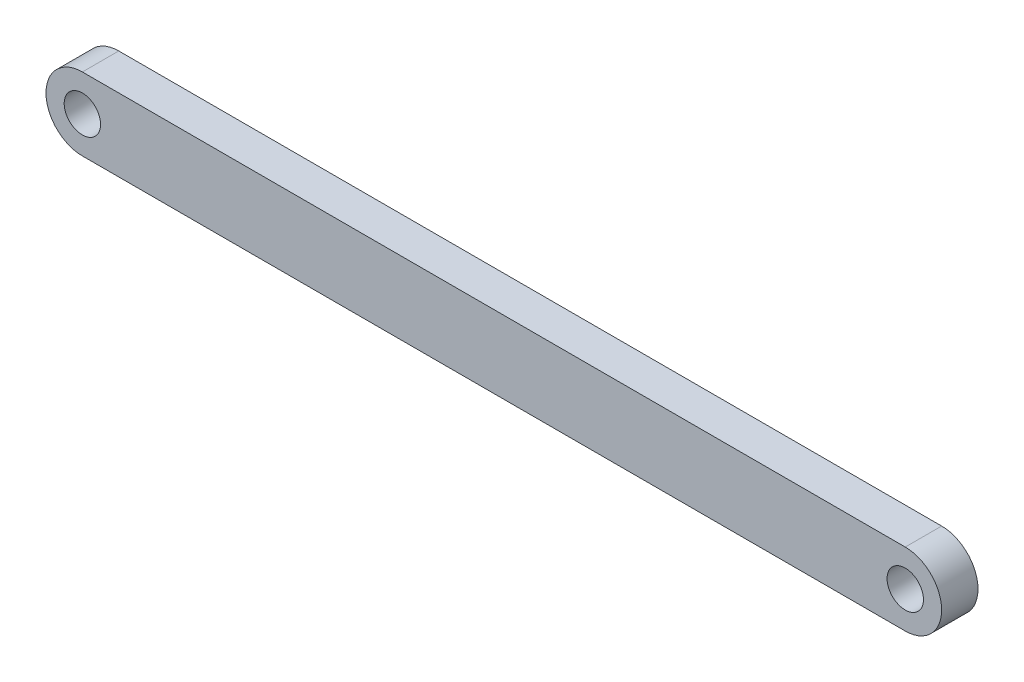
ISO-10303-21;
HEADER;
FILE_DESCRIPTION(('STEP AP214'),'2;1');
FILE_NAME('part.step','',(''),(''),'','','');
FILE_SCHEMA(('AUTOMOTIVE_DESIGN { 1 0 10303 214 1 1 1 1 }'));
ENDSEC;
DATA;
#1=APPLICATION_CONTEXT('core data for automotive mechanical design processes');
#2=APPLICATION_PROTOCOL_DEFINITION('international standard','automotive_design',2000,#1);
#3=PRODUCT_CONTEXT('',#1,'mechanical');
#4=PRODUCT('Part','Part','',(#3));
#5=PRODUCT_RELATED_PRODUCT_CATEGORY('part','',(#4));
#6=PRODUCT_DEFINITION_FORMATION('','',#4);
#7=PRODUCT_DEFINITION_CONTEXT('part definition',#1,'design');
#8=PRODUCT_DEFINITION('design','',#6,#7);
#9=PRODUCT_DEFINITION_SHAPE('','',#8);
#10=(LENGTH_UNIT() NAMED_UNIT(*) SI_UNIT(.MILLI.,.METRE.));
#11=(NAMED_UNIT(*) PLANE_ANGLE_UNIT() SI_UNIT($,.RADIAN.));
#12=(NAMED_UNIT(*) SI_UNIT($,.STERADIAN.) SOLID_ANGLE_UNIT());
#13=UNCERTAINTY_MEASURE_WITH_UNIT(LENGTH_MEASURE(1.E-05),#10,'distance_accuracy_value','');
#14=(GEOMETRIC_REPRESENTATION_CONTEXT(3) GLOBAL_UNCERTAINTY_ASSIGNED_CONTEXT((#13)) GLOBAL_UNIT_ASSIGNED_CONTEXT((#10,
#11,#12)) REPRESENTATION_CONTEXT('',''));
#15=CARTESIAN_POINT('',(0.,0.,0.));
#16=DIRECTION('',(0.,0.,1.));
#17=DIRECTION('',(1.,0.,0.));
#18=AXIS2_PLACEMENT_3D('',#15,#16,#17);
#19=CARTESIAN_POINT('',(56.55,0.,5.));
#20=DIRECTION('',(0.,0.,-1.));
#21=DIRECTION('',(-1.,0.,0.));
#22=AXIS2_PLACEMENT_3D('',#19,#20,#21);
#23=PLANE('',#22);
#24=CARTESIAN_POINT('',(56.55,0.,5.));
#25=DIRECTION('',(0.,0.,1.));
#26=DIRECTION('',(-1.,0.,0.));
#27=AXIS2_PLACEMENT_3D('',#24,#25,#26);
#28=CIRCLE('',#27,5.);
#29=CARTESIAN_POINT('',(56.55,-5.,5.));
#30=VERTEX_POINT('',#29);
#31=CARTESIAN_POINT('',(56.55,5.,5.));
#32=VERTEX_POINT('',#31);
#33=EDGE_CURVE('E98',#30,#32,#28,.T.);
#34=ORIENTED_EDGE('',*,*,#33,.T.);
#35=DIRECTION('',(-1.,0.,0.));
#36=VECTOR('',#35,1.);
#37=CARTESIAN_POINT('',(-56.55,5.,5.));
#38=LINE('',#37,#36);
#39=CARTESIAN_POINT('',(-56.55,5.,5.));
#40=VERTEX_POINT('',#39);
#41=EDGE_CURVE('E93',#32,#40,#38,.T.);
#42=ORIENTED_EDGE('',*,*,#41,.T.);
#43=CARTESIAN_POINT('',(-56.55,0.,5.));
#44=DIRECTION('',(0.,0.,1.));
#45=DIRECTION('',(1.,0.,0.));
#46=AXIS2_PLACEMENT_3D('',#43,#44,#45);
#47=CIRCLE('',#46,5.);
#48=CARTESIAN_POINT('',(-56.55,-5.,5.));
#49=VERTEX_POINT('',#48);
#50=EDGE_CURVE('E96',#40,#49,#47,.T.);
#51=ORIENTED_EDGE('',*,*,#50,.T.);
#52=DIRECTION('',(1.,0.,0.));
#53=VECTOR('',#52,1.);
#54=CARTESIAN_POINT('',(-56.55,-5.,5.));
#55=LINE('',#54,#53);
#56=EDGE_CURVE('E63',#49,#30,#55,.T.);
#57=ORIENTED_EDGE('',*,*,#56,.T.);
#58=EDGE_LOOP('',(#34,#42,#51,#57));
#59=FACE_BOUND('',#58,.T.);
#60=CARTESIAN_POINT('',(-56.55,0.,5.));
#61=DIRECTION('',(0.,0.,1.));
#62=DIRECTION('',(1.,0.,0.));
#63=AXIS2_PLACEMENT_3D('',#60,#61,#62);
#64=CIRCLE('',#63,2.5);
#65=CARTESIAN_POINT('',(-54.05,0.,5.));
#66=VERTEX_POINT('',#65);
#67=EDGE_CURVE('E118',#66,#66,#64,.T.);
#68=ORIENTED_EDGE('',*,*,#67,.F.);
#69=EDGE_LOOP('',(#68));
#70=FACE_BOUND('',#69,.T.);
#71=CARTESIAN_POINT('',(56.55,0.,5.));
#72=DIRECTION('',(0.,0.,1.));
#73=DIRECTION('',(1.,0.,0.));
#74=AXIS2_PLACEMENT_3D('',#71,#72,#73);
#75=CIRCLE('',#74,2.5);
#76=CARTESIAN_POINT('',(59.05,0.,5.));
#77=VERTEX_POINT('',#76);
#78=EDGE_CURVE('E140',#77,#77,#75,.T.);
#79=ORIENTED_EDGE('',*,*,#78,.F.);
#80=EDGE_LOOP('',(#79));
#81=FACE_BOUND('',#80,.T.);
#82=ADVANCED_FACE('F45',(#59,#70,#81),#23,.F.);
#83=CARTESIAN_POINT('',(56.55,0.,0.));
#84=DIRECTION('',(0.,0.,-1.));
#85=DIRECTION('',(-1.,0.,0.));
#86=AXIS2_PLACEMENT_3D('',#83,#84,#85);
#87=PLANE('',#86);
#88=CARTESIAN_POINT('',(-56.55,0.,0.));
#89=DIRECTION('',(0.,0.,1.));
#90=DIRECTION('',(1.,0.,0.));
#91=AXIS2_PLACEMENT_3D('',#88,#89,#90);
#92=CIRCLE('',#91,2.5);
#93=CARTESIAN_POINT('',(-54.05,0.,0.));
#94=VERTEX_POINT('',#93);
#95=EDGE_CURVE('E136',#94,#94,#92,.T.);
#96=ORIENTED_EDGE('',*,*,#95,.T.);
#97=EDGE_LOOP('',(#96));
#98=FACE_BOUND('',#97,.T.);
#99=CARTESIAN_POINT('',(56.55,0.,0.));
#100=DIRECTION('',(0.,0.,1.));
#101=DIRECTION('',(-1.,0.,0.));
#102=AXIS2_PLACEMENT_3D('',#99,#100,#101);
#103=CIRCLE('',#102,5.);
#104=CARTESIAN_POINT('',(56.55,-5.,0.));
#105=VERTEX_POINT('',#104);
#106=CARTESIAN_POINT('',(56.55,5.,0.));
#107=VERTEX_POINT('',#106);
#108=EDGE_CURVE('E114',#105,#107,#103,.T.);
#109=ORIENTED_EDGE('',*,*,#108,.F.);
#110=DIRECTION('',(1.,0.,0.));
#111=VECTOR('',#110,1.);
#112=CARTESIAN_POINT('',(-56.55,-5.,0.));
#113=LINE('',#112,#111);
#114=CARTESIAN_POINT('',(-56.55,-5.,0.));
#115=VERTEX_POINT('',#114);
#116=EDGE_CURVE('E86',#115,#105,#113,.T.);
#117=ORIENTED_EDGE('',*,*,#116,.F.);
#118=CARTESIAN_POINT('',(-56.55,0.,0.));
#119=DIRECTION('',(0.,0.,1.));
#120=DIRECTION('',(1.,0.,0.));
#121=AXIS2_PLACEMENT_3D('',#118,#119,#120);
#122=CIRCLE('',#121,5.);
#123=CARTESIAN_POINT('',(-56.55,5.,0.));
#124=VERTEX_POINT('',#123);
#125=EDGE_CURVE('E80',#124,#115,#122,.T.);
#126=ORIENTED_EDGE('',*,*,#125,.F.);
#127=DIRECTION('',(-1.,0.,0.));
#128=VECTOR('',#127,1.);
#129=CARTESIAN_POINT('',(-56.55,5.,0.));
#130=LINE('',#129,#128);
#131=EDGE_CURVE('E103',#107,#124,#130,.T.);
#132=ORIENTED_EDGE('',*,*,#131,.F.);
#133=EDGE_LOOP('',(#109,#117,#126,#132));
#134=FACE_BOUND('',#133,.T.);
#135=CARTESIAN_POINT('',(56.55,0.,0.));
#136=DIRECTION('',(0.,0.,1.));
#137=DIRECTION('',(1.,0.,0.));
#138=AXIS2_PLACEMENT_3D('',#135,#136,#137);
#139=CIRCLE('',#138,2.5);
#140=CARTESIAN_POINT('',(59.05,0.,0.));
#141=VERTEX_POINT('',#140);
#142=EDGE_CURVE('E144',#141,#141,#139,.T.);
#143=ORIENTED_EDGE('',*,*,#142,.T.);
#144=EDGE_LOOP('',(#143));
#145=FACE_BOUND('',#144,.T.);
#146=ADVANCED_FACE('F131',(#98,#134,#145),#87,.T.);
#147=CARTESIAN_POINT('',(56.55,0.,5.));
#148=DIRECTION('',(0.,0.,-1.));
#149=DIRECTION('',(-1.,0.,0.));
#150=AXIS2_PLACEMENT_3D('',#147,#148,#149);
#151=CYLINDRICAL_SURFACE('',#150,5.);
#152=ORIENTED_EDGE('',*,*,#108,.T.);
#153=DIRECTION('',(0.,0.,-1.));
#154=VECTOR('',#153,1.);
#155=CARTESIAN_POINT('',(56.55,5.,5.));
#156=LINE('',#155,#154);
#157=EDGE_CURVE('E11',#32,#107,#156,.T.);
#158=ORIENTED_EDGE('',*,*,#157,.F.);
#159=ORIENTED_EDGE('',*,*,#33,.F.);
#160=DIRECTION('',(0.,0.,-1.));
#161=VECTOR('',#160,1.);
#162=CARTESIAN_POINT('',(56.55,-5.,5.));
#163=LINE('',#162,#161);
#164=EDGE_CURVE('E110',#30,#105,#163,.T.);
#165=ORIENTED_EDGE('',*,*,#164,.T.);
#166=EDGE_LOOP('',(#152,#158,#159,#165));
#167=FACE_BOUND('',#166,.T.);
#168=ADVANCED_FACE('F47',(#167),#151,.T.);
#169=CARTESIAN_POINT('',(-56.55,5.,5.));
#170=DIRECTION('',(0.,-1.,0.));
#171=DIRECTION('',(0.,0.,-1.));
#172=AXIS2_PLACEMENT_3D('',#169,#170,#171);
#173=PLANE('',#172);
#174=ORIENTED_EDGE('',*,*,#131,.T.);
#175=DIRECTION('',(0.,0.,-1.));
#176=VECTOR('',#175,1.);
#177=CARTESIAN_POINT('',(-56.55,5.,5.));
#178=LINE('',#177,#176);
#179=EDGE_CURVE('E55',#40,#124,#178,.T.);
#180=ORIENTED_EDGE('',*,*,#179,.F.);
#181=ORIENTED_EDGE('',*,*,#41,.F.);
#182=ORIENTED_EDGE('',*,*,#157,.T.);
#183=EDGE_LOOP('',(#174,#180,#181,#182));
#184=FACE_BOUND('',#183,.T.);
#185=ADVANCED_FACE('F102',(#184),#173,.F.);
#186=CARTESIAN_POINT('',(-56.55,0.,5.));
#187=DIRECTION('',(0.,0.,-1.));
#188=DIRECTION('',(-1.,0.,0.));
#189=AXIS2_PLACEMENT_3D('',#186,#187,#188);
#190=CYLINDRICAL_SURFACE('',#189,5.);
#191=ORIENTED_EDGE('',*,*,#125,.T.);
#192=DIRECTION('',(0.,0.,-1.));
#193=VECTOR('',#192,1.);
#194=CARTESIAN_POINT('',(-56.55,-5.,5.));
#195=LINE('',#194,#193);
#196=EDGE_CURVE('E105',#49,#115,#195,.T.);
#197=ORIENTED_EDGE('',*,*,#196,.F.);
#198=ORIENTED_EDGE('',*,*,#50,.F.);
#199=ORIENTED_EDGE('',*,*,#179,.T.);
#200=EDGE_LOOP('',(#191,#197,#198,#199));
#201=FACE_BOUND('',#200,.T.);
#202=ADVANCED_FACE('F106',(#201),#190,.T.);
#203=CARTESIAN_POINT('',(-56.55,-5.,5.));
#204=DIRECTION('',(0.,1.,0.));
#205=DIRECTION('',(0.,0.,1.));
#206=AXIS2_PLACEMENT_3D('',#203,#204,#205);
#207=PLANE('',#206);
#208=ORIENTED_EDGE('',*,*,#116,.T.);
#209=ORIENTED_EDGE('',*,*,#164,.F.);
#210=ORIENTED_EDGE('',*,*,#56,.F.);
#211=ORIENTED_EDGE('',*,*,#196,.T.);
#212=EDGE_LOOP('',(#208,#209,#210,#211));
#213=FACE_BOUND('',#212,.T.);
#214=ADVANCED_FACE('F128',(#213),#207,.F.);
#215=CARTESIAN_POINT('',(-56.55,0.,5.));
#216=DIRECTION('',(0.,0.,-1.));
#217=DIRECTION('',(-1.,0.,0.));
#218=AXIS2_PLACEMENT_3D('',#215,#216,#217);
#219=CYLINDRICAL_SURFACE('',#218,2.5);
#220=ORIENTED_EDGE('',*,*,#67,.T.);
#221=EDGE_LOOP('',(#220));
#222=FACE_BOUND('',#221,.T.);
#223=ORIENTED_EDGE('',*,*,#95,.F.);
#224=EDGE_LOOP('',(#223));
#225=FACE_BOUND('',#224,.T.);
#226=ADVANCED_FACE('F163',(#222,#225),#219,.F.);
#227=CARTESIAN_POINT('',(56.55,0.,5.));
#228=DIRECTION('',(0.,0.,-1.));
#229=DIRECTION('',(-1.,0.,0.));
#230=AXIS2_PLACEMENT_3D('',#227,#228,#229);
#231=CYLINDRICAL_SURFACE('',#230,2.5);
#232=ORIENTED_EDGE('',*,*,#78,.T.);
#233=EDGE_LOOP('',(#232));
#234=FACE_BOUND('',#233,.T.);
#235=ORIENTED_EDGE('',*,*,#142,.F.);
#236=EDGE_LOOP('',(#235));
#237=FACE_BOUND('',#236,.T.);
#238=ADVANCED_FACE('F152',(#234,#237),#231,.F.);
#239=CLOSED_SHELL('',(#82,#146,#168,#185,#202,#214,#226,#238));
#240=MANIFOLD_SOLID_BREP('B2',#239);
#241=ADVANCED_BREP_SHAPE_REPRESENTATION('',(#18,#240),#14);
#242=SHAPE_DEFINITION_REPRESENTATION(#9,#241);
ENDSEC;
END-ISO-10303-21;
